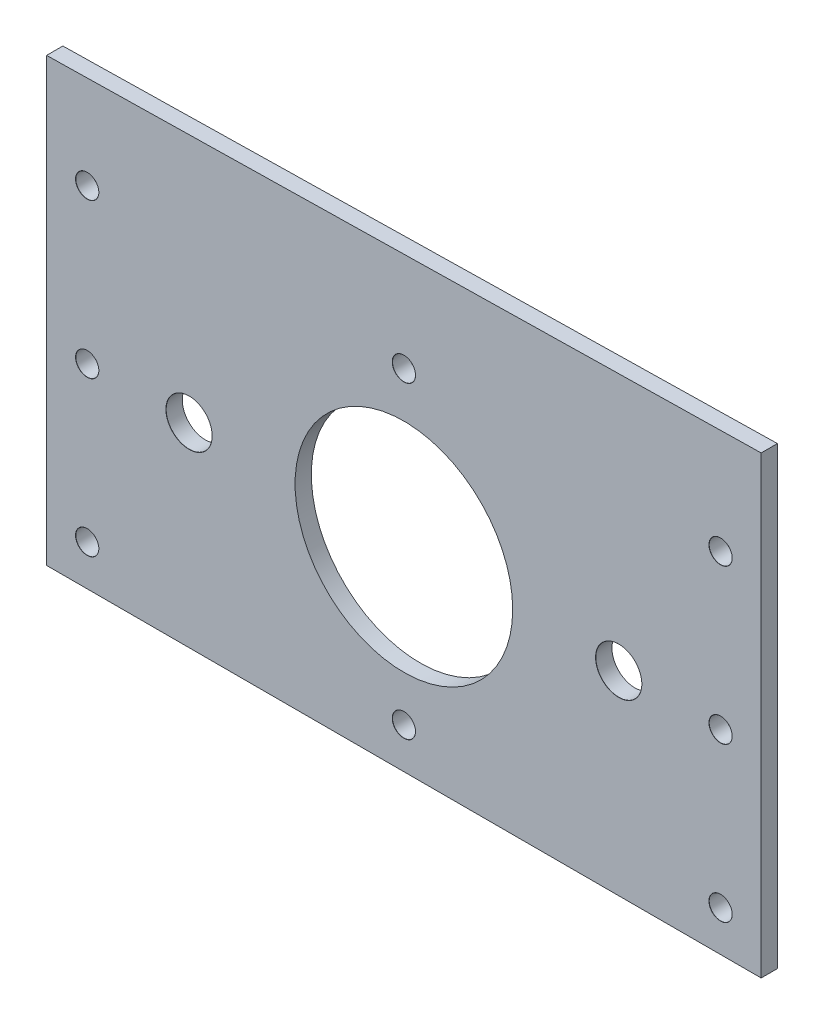
ISO-10303-21;
HEADER;
FILE_DESCRIPTION(('STEP AP214'),'2;1');
FILE_NAME('part.step','',(''),(''),'','','');
FILE_SCHEMA(('AUTOMOTIVE_DESIGN { 1 0 10303 214 1 1 1 1 }'));
ENDSEC;
DATA;
#1=APPLICATION_CONTEXT('core data for automotive mechanical design processes');
#2=APPLICATION_PROTOCOL_DEFINITION('international standard','automotive_design',2000,#1);
#3=PRODUCT_CONTEXT('',#1,'mechanical');
#4=PRODUCT('Part','Part','',(#3));
#5=PRODUCT_RELATED_PRODUCT_CATEGORY('part','',(#4));
#6=PRODUCT_DEFINITION_FORMATION('','',#4);
#7=PRODUCT_DEFINITION_CONTEXT('part definition',#1,'design');
#8=PRODUCT_DEFINITION('design','',#6,#7);
#9=PRODUCT_DEFINITION_SHAPE('','',#8);
#10=(LENGTH_UNIT() NAMED_UNIT(*) SI_UNIT(.MILLI.,.METRE.));
#11=(NAMED_UNIT(*) PLANE_ANGLE_UNIT() SI_UNIT($,.RADIAN.));
#12=(NAMED_UNIT(*) SI_UNIT($,.STERADIAN.) SOLID_ANGLE_UNIT());
#13=UNCERTAINTY_MEASURE_WITH_UNIT(LENGTH_MEASURE(1.E-05),#10,'distance_accuracy_value','');
#14=(GEOMETRIC_REPRESENTATION_CONTEXT(3) GLOBAL_UNCERTAINTY_ASSIGNED_CONTEXT((#13)) GLOBAL_UNIT_ASSIGNED_CONTEXT((#10,
#11,#12)) REPRESENTATION_CONTEXT('',''));
#15=CARTESIAN_POINT('',(0.,0.,0.));
#16=DIRECTION('',(0.,0.,1.));
#17=DIRECTION('',(1.,0.,0.));
#18=AXIS2_PLACEMENT_3D('',#15,#16,#17);
#19=CARTESIAN_POINT('',(69.85,38.1,3.175));
#20=DIRECTION('',(-1.,0.,0.));
#21=DIRECTION('',(0.,0.,1.));
#22=AXIS2_PLACEMENT_3D('',#19,#20,#21);
#23=PLANE('',#22);
#24=DIRECTION('',(0.,1.,0.));
#25=VECTOR('',#24,1.);
#26=CARTESIAN_POINT('',(69.85,38.1,0.));
#27=LINE('',#26,#25);
#28=CARTESIAN_POINT('',(69.85,-38.1,0.));
#29=VERTEX_POINT('',#28);
#30=CARTESIAN_POINT('',(69.85,50.8,0.));
#31=VERTEX_POINT('',#30);
#32=EDGE_CURVE('E80',#29,#31,#27,.T.);
#33=ORIENTED_EDGE('',*,*,#32,.T.);
#34=DIRECTION('',(0.,0.,-1.));
#35=VECTOR('',#34,1.);
#36=CARTESIAN_POINT('',(69.85,50.8,3.175));
#37=LINE('',#36,#35);
#38=CARTESIAN_POINT('',(69.85,50.8,3.175));
#39=VERTEX_POINT('',#38);
#40=EDGE_CURVE('E11',#39,#31,#37,.T.);
#41=ORIENTED_EDGE('',*,*,#40,.F.);
#42=DIRECTION('',(0.,1.,0.));
#43=VECTOR('',#42,1.);
#44=CARTESIAN_POINT('',(69.85,38.1,3.175));
#45=LINE('',#44,#43);
#46=CARTESIAN_POINT('',(69.85,-38.1,3.175));
#47=VERTEX_POINT('',#46);
#48=EDGE_CURVE('E85',#47,#39,#45,.T.);
#49=ORIENTED_EDGE('',*,*,#48,.F.);
#50=DIRECTION('',(0.,0.,-1.));
#51=VECTOR('',#50,1.);
#52=CARTESIAN_POINT('',(69.85,-38.1,3.175));
#53=LINE('',#52,#51);
#54=EDGE_CURVE('E101',#47,#29,#53,.T.);
#55=ORIENTED_EDGE('',*,*,#54,.T.);
#56=EDGE_LOOP('',(#33,#41,#49,#55));
#57=FACE_BOUND('',#56,.T.);
#58=ADVANCED_FACE('F41',(#57),#23,.F.);
#59=CARTESIAN_POINT('',(-69.85,48.26,3.175));
#60=DIRECTION('',(0.0181788136675149,-0.999834751713323,0.));
#61=DIRECTION('',(0.999834751713323,0.0181788136675149,0.));
#62=AXIS2_PLACEMENT_3D('',#59,#60,#61);
#63=PLANE('',#62);
#64=DIRECTION('',(-0.999834751713323,-0.0181788136675149,0.));
#65=VECTOR('',#64,1.);
#66=CARTESIAN_POINT('',(-69.85,48.26,0.));
#67=LINE('',#66,#65);
#68=CARTESIAN_POINT('',(-69.85,48.26,0.));
#69=VERTEX_POINT('',#68);
#70=EDGE_CURVE('E97',#31,#69,#67,.T.);
#71=ORIENTED_EDGE('',*,*,#70,.T.);
#72=DIRECTION('',(0.,0.,-1.));
#73=VECTOR('',#72,1.);
#74=CARTESIAN_POINT('',(-69.85,48.26,3.175));
#75=LINE('',#74,#73);
#76=CARTESIAN_POINT('',(-69.85,48.26,3.175));
#77=VERTEX_POINT('',#76);
#78=EDGE_CURVE('E49',#77,#69,#75,.T.);
#79=ORIENTED_EDGE('',*,*,#78,.F.);
#80=DIRECTION('',(-0.999834751713323,-0.0181788136675149,0.));
#81=VECTOR('',#80,1.);
#82=CARTESIAN_POINT('',(-69.85,48.26,3.175));
#83=LINE('',#82,#81);
#84=EDGE_CURVE('E88',#39,#77,#83,.T.);
#85=ORIENTED_EDGE('',*,*,#84,.F.);
#86=ORIENTED_EDGE('',*,*,#40,.T.);
#87=EDGE_LOOP('',(#71,#79,#85,#86));
#88=FACE_BOUND('',#87,.T.);
#89=ADVANCED_FACE('F96',(#88),#63,.F.);
#90=CARTESIAN_POINT('',(-69.85,38.1,3.175));
#91=DIRECTION('',(1.,0.,0.));
#92=DIRECTION('',(0.,0.,-1.));
#93=AXIS2_PLACEMENT_3D('',#90,#91,#92);
#94=PLANE('',#93);
#95=DIRECTION('',(0.,-1.,0.));
#96=VECTOR('',#95,1.);
#97=CARTESIAN_POINT('',(-69.85,38.1,0.));
#98=LINE('',#97,#96);
#99=CARTESIAN_POINT('',(-69.85,-38.1,0.));
#100=VERTEX_POINT('',#99);
#101=EDGE_CURVE('E73',#69,#100,#98,.T.);
#102=ORIENTED_EDGE('',*,*,#101,.T.);
#103=DIRECTION('',(0.,0.,-1.));
#104=VECTOR('',#103,1.);
#105=CARTESIAN_POINT('',(-69.85,-38.1,3.175));
#106=LINE('',#105,#104);
#107=CARTESIAN_POINT('',(-69.85,-38.1,3.175));
#108=VERTEX_POINT('',#107);
#109=EDGE_CURVE('E98',#108,#100,#106,.T.);
#110=ORIENTED_EDGE('',*,*,#109,.F.);
#111=DIRECTION('',(0.,-1.,0.));
#112=VECTOR('',#111,1.);
#113=CARTESIAN_POINT('',(-69.85,48.26,3.175));
#114=LINE('',#113,#112);
#115=EDGE_CURVE('E92',#77,#108,#114,.T.);
#116=ORIENTED_EDGE('',*,*,#115,.F.);
#117=ORIENTED_EDGE('',*,*,#78,.T.);
#118=EDGE_LOOP('',(#102,#110,#116,#117));
#119=FACE_BOUND('',#118,.T.);
#120=ADVANCED_FACE('F99',(#119),#94,.F.);
#121=CARTESIAN_POINT('',(-69.85,-38.1,3.175));
#122=DIRECTION('',(0.,1.,0.));
#123=DIRECTION('',(0.,0.,1.));
#124=AXIS2_PLACEMENT_3D('',#121,#122,#123);
#125=PLANE('',#124);
#126=DIRECTION('',(1.,0.,0.));
#127=VECTOR('',#126,1.);
#128=CARTESIAN_POINT('',(-69.85,-38.1,0.));
#129=LINE('',#128,#127);
#130=EDGE_CURVE('E109',#100,#29,#129,.T.);
#131=ORIENTED_EDGE('',*,*,#130,.T.);
#132=ORIENTED_EDGE('',*,*,#54,.F.);
#133=DIRECTION('',(1.,0.,0.));
#134=VECTOR('',#133,1.);
#135=CARTESIAN_POINT('',(-69.85,-38.1,3.175));
#136=LINE('',#135,#134);
#137=EDGE_CURVE('E57',#108,#47,#136,.T.);
#138=ORIENTED_EDGE('',*,*,#137,.F.);
#139=ORIENTED_EDGE('',*,*,#109,.T.);
#140=EDGE_LOOP('',(#131,#132,#138,#139));
#141=FACE_BOUND('',#140,.T.);
#142=ADVANCED_FACE('F114',(#141),#125,.F.);
#143=CARTESIAN_POINT('',(0.,0.,3.175));
#144=DIRECTION('',(0.,0.,1.));
#145=DIRECTION('',(1.,0.,0.));
#146=AXIS2_PLACEMENT_3D('',#143,#144,#145);
#147=PLANE('',#146);
#148=CARTESIAN_POINT('',(0.,0.,3.175));
#149=DIRECTION('',(0.,0.,1.));
#150=DIRECTION('',(1.,0.,0.));
#151=AXIS2_PLACEMENT_3D('',#148,#149,#150);
#152=CIRCLE('',#151,21.275);
#153=CARTESIAN_POINT('',(21.275,0.,3.175));
#154=VERTEX_POINT('',#153);
#155=EDGE_CURVE('E228',#154,#154,#152,.T.);
#156=ORIENTED_EDGE('',*,*,#155,.F.);
#157=EDGE_LOOP('',(#156));
#158=FACE_BOUND('',#157,.T.);
#159=CARTESIAN_POINT('',(-42.,0.,3.175));
#160=DIRECTION('',(0.,0.,1.));
#161=DIRECTION('',(1.,0.,0.));
#162=AXIS2_PLACEMENT_3D('',#159,#160,#161);
#163=CIRCLE('',#162,4.525);
#164=CARTESIAN_POINT('',(-37.475,0.,3.175));
#165=VERTEX_POINT('',#164);
#166=EDGE_CURVE('E224',#165,#165,#163,.T.);
#167=ORIENTED_EDGE('',*,*,#166,.F.);
#168=EDGE_LOOP('',(#167));
#169=FACE_BOUND('',#168,.T.);
#170=CARTESIAN_POINT('',(42.,0.,3.175));
#171=DIRECTION('',(0.,0.,1.));
#172=DIRECTION('',(1.,0.,0.));
#173=AXIS2_PLACEMENT_3D('',#170,#171,#172);
#174=CIRCLE('',#173,4.525);
#175=CARTESIAN_POINT('',(46.525,0.,3.175));
#176=VERTEX_POINT('',#175);
#177=EDGE_CURVE('E215',#176,#176,#174,.T.);
#178=ORIENTED_EDGE('',*,*,#177,.F.);
#179=EDGE_LOOP('',(#178));
#180=FACE_BOUND('',#179,.T.);
#181=CARTESIAN_POINT('',(-61.9125,-30.1625,3.175));
#182=DIRECTION('',(0.,0.,1.));
#183=DIRECTION('',(1.,0.,0.));
#184=AXIS2_PLACEMENT_3D('',#181,#182,#183);
#185=CIRCLE('',#184,2.275);
#186=CARTESIAN_POINT('',(-59.6375,-30.1625,3.175));
#187=VERTEX_POINT('',#186);
#188=EDGE_CURVE('E206',#187,#187,#185,.T.);
#189=ORIENTED_EDGE('',*,*,#188,.F.);
#190=EDGE_LOOP('',(#189));
#191=FACE_BOUND('',#190,.T.);
#192=CARTESIAN_POINT('',(0.,-30.1625,3.175));
#193=DIRECTION('',(0.,0.,1.));
#194=DIRECTION('',(1.,0.,0.));
#195=AXIS2_PLACEMENT_3D('',#192,#193,#194);
#196=CIRCLE('',#195,2.275);
#197=CARTESIAN_POINT('',(2.275,-30.1625,3.175));
#198=VERTEX_POINT('',#197);
#199=EDGE_CURVE('E197',#198,#198,#196,.T.);
#200=ORIENTED_EDGE('',*,*,#199,.F.);
#201=EDGE_LOOP('',(#200));
#202=FACE_BOUND('',#201,.T.);
#203=CARTESIAN_POINT('',(61.9125,-30.1625,3.175));
#204=DIRECTION('',(0.,0.,1.));
#205=DIRECTION('',(1.,0.,0.));
#206=AXIS2_PLACEMENT_3D('',#203,#204,#205);
#207=CIRCLE('',#206,2.275);
#208=CARTESIAN_POINT('',(64.1875,-30.1625,3.175));
#209=VERTEX_POINT('',#208);
#210=EDGE_CURVE('E188',#209,#209,#207,.T.);
#211=ORIENTED_EDGE('',*,*,#210,.F.);
#212=EDGE_LOOP('',(#211));
#213=FACE_BOUND('',#212,.T.);
#214=CARTESIAN_POINT('',(61.9125,30.1625,3.175));
#215=DIRECTION('',(0.,0.,1.));
#216=DIRECTION('',(1.,0.,0.));
#217=AXIS2_PLACEMENT_3D('',#214,#215,#216);
#218=CIRCLE('',#217,2.275);
#219=CARTESIAN_POINT('',(64.1875,30.1625,3.175));
#220=VERTEX_POINT('',#219);
#221=EDGE_CURVE('E179',#220,#220,#218,.T.);
#222=ORIENTED_EDGE('',*,*,#221,.F.);
#223=EDGE_LOOP('',(#222));
#224=FACE_BOUND('',#223,.T.);
#225=CARTESIAN_POINT('',(61.9125,0.,3.175));
#226=DIRECTION('',(0.,0.,1.));
#227=DIRECTION('',(1.,0.,0.));
#228=AXIS2_PLACEMENT_3D('',#225,#226,#227);
#229=CIRCLE('',#228,2.275);
#230=CARTESIAN_POINT('',(64.1875,0.,3.175));
#231=VERTEX_POINT('',#230);
#232=EDGE_CURVE('E170',#231,#231,#229,.T.);
#233=ORIENTED_EDGE('',*,*,#232,.F.);
#234=EDGE_LOOP('',(#233));
#235=FACE_BOUND('',#234,.T.);
#236=CARTESIAN_POINT('',(0.,30.1625,3.175));
#237=DIRECTION('',(0.,0.,1.));
#238=DIRECTION('',(1.,0.,0.));
#239=AXIS2_PLACEMENT_3D('',#236,#237,#238);
#240=CIRCLE('',#239,2.275);
#241=CARTESIAN_POINT('',(2.27499999999999,30.1625,3.175));
#242=VERTEX_POINT('',#241);
#243=EDGE_CURVE('E161',#242,#242,#240,.T.);
#244=ORIENTED_EDGE('',*,*,#243,.F.);
#245=EDGE_LOOP('',(#244));
#246=FACE_BOUND('',#245,.T.);
#247=CARTESIAN_POINT('',(-61.9125,30.1625,3.175));
#248=DIRECTION('',(0.,0.,1.));
#249=DIRECTION('',(1.,0.,0.));
#250=AXIS2_PLACEMENT_3D('',#247,#248,#249);
#251=CIRCLE('',#250,2.275);
#252=CARTESIAN_POINT('',(-59.6375,30.1625,3.175));
#253=VERTEX_POINT('',#252);
#254=EDGE_CURVE('E152',#253,#253,#251,.T.);
#255=ORIENTED_EDGE('',*,*,#254,.F.);
#256=EDGE_LOOP('',(#255));
#257=FACE_BOUND('',#256,.T.);
#258=CARTESIAN_POINT('',(-61.9125,0.,3.175));
#259=DIRECTION('',(0.,0.,1.));
#260=DIRECTION('',(1.,0.,0.));
#261=AXIS2_PLACEMENT_3D('',#258,#259,#260);
#262=CIRCLE('',#261,2.275);
#263=CARTESIAN_POINT('',(-59.6375,0.,3.175));
#264=VERTEX_POINT('',#263);
#265=EDGE_CURVE('E143',#264,#264,#262,.T.);
#266=ORIENTED_EDGE('',*,*,#265,.F.);
#267=EDGE_LOOP('',(#266));
#268=FACE_BOUND('',#267,.T.);
#269=ORIENTED_EDGE('',*,*,#48,.T.);
#270=ORIENTED_EDGE('',*,*,#84,.T.);
#271=ORIENTED_EDGE('',*,*,#115,.T.);
#272=ORIENTED_EDGE('',*,*,#137,.T.);
#273=EDGE_LOOP('',(#269,#270,#271,#272));
#274=FACE_BOUND('',#273,.T.);
#275=ADVANCED_FACE('F90',(#158,#169,#180,#191,#202,#213,#224,#235,#246,#257,#268,#274),#147,.T.);
#276=CARTESIAN_POINT('',(0.,0.,0.));
#277=DIRECTION('',(0.,0.,1.));
#278=DIRECTION('',(1.,0.,0.));
#279=AXIS2_PLACEMENT_3D('',#276,#277,#278);
#280=PLANE('',#279);
#281=CARTESIAN_POINT('',(0.,0.,0.));
#282=DIRECTION('',(0.,0.,1.));
#283=DIRECTION('',(1.,0.,0.));
#284=AXIS2_PLACEMENT_3D('',#281,#282,#283);
#285=CIRCLE('',#284,21.275);
#286=CARTESIAN_POINT('',(21.275,0.,0.));
#287=VERTEX_POINT('',#286);
#288=EDGE_CURVE('E227',#287,#287,#285,.T.);
#289=ORIENTED_EDGE('',*,*,#288,.T.);
#290=EDGE_LOOP('',(#289));
#291=FACE_BOUND('',#290,.T.);
#292=CARTESIAN_POINT('',(-42.,0.,0.));
#293=DIRECTION('',(0.,0.,1.));
#294=DIRECTION('',(1.,0.,0.));
#295=AXIS2_PLACEMENT_3D('',#292,#293,#294);
#296=CIRCLE('',#295,4.5);
#297=CARTESIAN_POINT('',(-37.5,0.,0.));
#298=VERTEX_POINT('',#297);
#299=EDGE_CURVE('E218',#298,#298,#296,.T.);
#300=ORIENTED_EDGE('',*,*,#299,.T.);
#301=EDGE_LOOP('',(#300));
#302=FACE_BOUND('',#301,.T.);
#303=CARTESIAN_POINT('',(42.,0.,0.));
#304=DIRECTION('',(0.,0.,1.));
#305=DIRECTION('',(1.,0.,0.));
#306=AXIS2_PLACEMENT_3D('',#303,#304,#305);
#307=CIRCLE('',#306,4.5);
#308=CARTESIAN_POINT('',(46.5,0.,0.));
#309=VERTEX_POINT('',#308);
#310=EDGE_CURVE('E209',#309,#309,#307,.T.);
#311=ORIENTED_EDGE('',*,*,#310,.T.);
#312=EDGE_LOOP('',(#311));
#313=FACE_BOUND('',#312,.T.);
#314=CARTESIAN_POINT('',(-61.9125,-30.1625,0.));
#315=DIRECTION('',(0.,0.,1.));
#316=DIRECTION('',(1.,0.,0.));
#317=AXIS2_PLACEMENT_3D('',#314,#315,#316);
#318=CIRCLE('',#317,2.25);
#319=CARTESIAN_POINT('',(-59.6625,-30.1625,0.));
#320=VERTEX_POINT('',#319);
#321=EDGE_CURVE('E200',#320,#320,#318,.T.);
#322=ORIENTED_EDGE('',*,*,#321,.T.);
#323=EDGE_LOOP('',(#322));
#324=FACE_BOUND('',#323,.T.);
#325=CARTESIAN_POINT('',(0.,-30.1625,0.));
#326=DIRECTION('',(0.,0.,1.));
#327=DIRECTION('',(1.,0.,0.));
#328=AXIS2_PLACEMENT_3D('',#325,#326,#327);
#329=CIRCLE('',#328,2.25);
#330=CARTESIAN_POINT('',(2.25,-30.1625,0.));
#331=VERTEX_POINT('',#330);
#332=EDGE_CURVE('E191',#331,#331,#329,.T.);
#333=ORIENTED_EDGE('',*,*,#332,.T.);
#334=EDGE_LOOP('',(#333));
#335=FACE_BOUND('',#334,.T.);
#336=CARTESIAN_POINT('',(61.9125,-30.1625,0.));
#337=DIRECTION('',(0.,0.,1.));
#338=DIRECTION('',(1.,0.,0.));
#339=AXIS2_PLACEMENT_3D('',#336,#337,#338);
#340=CIRCLE('',#339,2.25);
#341=CARTESIAN_POINT('',(64.1625,-30.1625,0.));
#342=VERTEX_POINT('',#341);
#343=EDGE_CURVE('E182',#342,#342,#340,.T.);
#344=ORIENTED_EDGE('',*,*,#343,.T.);
#345=EDGE_LOOP('',(#344));
#346=FACE_BOUND('',#345,.T.);
#347=CARTESIAN_POINT('',(61.9125,30.1625,0.));
#348=DIRECTION('',(0.,0.,1.));
#349=DIRECTION('',(1.,0.,0.));
#350=AXIS2_PLACEMENT_3D('',#347,#348,#349);
#351=CIRCLE('',#350,2.25);
#352=CARTESIAN_POINT('',(64.1625,30.1625,0.));
#353=VERTEX_POINT('',#352);
#354=EDGE_CURVE('E173',#353,#353,#351,.T.);
#355=ORIENTED_EDGE('',*,*,#354,.T.);
#356=EDGE_LOOP('',(#355));
#357=FACE_BOUND('',#356,.T.);
#358=CARTESIAN_POINT('',(61.9125,0.,0.));
#359=DIRECTION('',(0.,0.,1.));
#360=DIRECTION('',(1.,0.,0.));
#361=AXIS2_PLACEMENT_3D('',#358,#359,#360);
#362=CIRCLE('',#361,2.25);
#363=CARTESIAN_POINT('',(64.1625,0.,0.));
#364=VERTEX_POINT('',#363);
#365=EDGE_CURVE('E164',#364,#364,#362,.T.);
#366=ORIENTED_EDGE('',*,*,#365,.T.);
#367=EDGE_LOOP('',(#366));
#368=FACE_BOUND('',#367,.T.);
#369=CARTESIAN_POINT('',(0.,30.1625,0.));
#370=DIRECTION('',(0.,0.,1.));
#371=DIRECTION('',(1.,0.,0.));
#372=AXIS2_PLACEMENT_3D('',#369,#370,#371);
#373=CIRCLE('',#372,2.25);
#374=CARTESIAN_POINT('',(2.24999999999999,30.1625,0.));
#375=VERTEX_POINT('',#374);
#376=EDGE_CURVE('E155',#375,#375,#373,.T.);
#377=ORIENTED_EDGE('',*,*,#376,.T.);
#378=EDGE_LOOP('',(#377));
#379=FACE_BOUND('',#378,.T.);
#380=CARTESIAN_POINT('',(-61.9125,30.1625,0.));
#381=DIRECTION('',(0.,0.,1.));
#382=DIRECTION('',(1.,0.,0.));
#383=AXIS2_PLACEMENT_3D('',#380,#381,#382);
#384=CIRCLE('',#383,2.25);
#385=CARTESIAN_POINT('',(-59.6625,30.1625,0.));
#386=VERTEX_POINT('',#385);
#387=EDGE_CURVE('E146',#386,#386,#384,.T.);
#388=ORIENTED_EDGE('',*,*,#387,.T.);
#389=EDGE_LOOP('',(#388));
#390=FACE_BOUND('',#389,.T.);
#391=CARTESIAN_POINT('',(-61.9125,0.,0.));
#392=DIRECTION('',(0.,0.,1.));
#393=DIRECTION('',(1.,0.,0.));
#394=AXIS2_PLACEMENT_3D('',#391,#392,#393);
#395=CIRCLE('',#394,2.25);
#396=CARTESIAN_POINT('',(-59.6625,0.,0.));
#397=VERTEX_POINT('',#396);
#398=EDGE_CURVE('E106',#397,#397,#395,.T.);
#399=ORIENTED_EDGE('',*,*,#398,.T.);
#400=EDGE_LOOP('',(#399));
#401=FACE_BOUND('',#400,.T.);
#402=ORIENTED_EDGE('',*,*,#32,.F.);
#403=ORIENTED_EDGE('',*,*,#130,.F.);
#404=ORIENTED_EDGE('',*,*,#101,.F.);
#405=ORIENTED_EDGE('',*,*,#70,.F.);
#406=EDGE_LOOP('',(#402,#403,#404,#405));
#407=FACE_BOUND('',#406,.T.);
#408=ADVANCED_FACE('F115',(#291,#302,#313,#324,#335,#346,#357,#368,#379,#390,#401,#407),#280,.F.);
#409=CARTESIAN_POINT('',(-61.9125,0.,3.175));
#410=DIRECTION('',(0.,0.,1.));
#411=DIRECTION('',(1.,0.,0.));
#412=AXIS2_PLACEMENT_3D('',#409,#410,#411);
#413=CYLINDRICAL_SURFACE('',#412,2.25);
#414=ORIENTED_EDGE('',*,*,#398,.F.);
#415=EDGE_LOOP('',(#414));
#416=FACE_BOUND('',#415,.T.);
#417=CARTESIAN_POINT('',(-61.9125,0.,3.15));
#418=DIRECTION('',(0.,0.,1.));
#419=DIRECTION('',(1.,0.,0.));
#420=AXIS2_PLACEMENT_3D('',#417,#418,#419);
#421=CIRCLE('',#420,2.25);
#422=CARTESIAN_POINT('',(-59.6625,0.,3.15));
#423=VERTEX_POINT('',#422);
#424=EDGE_CURVE('E140',#423,#423,#421,.T.);
#425=ORIENTED_EDGE('',*,*,#424,.T.);
#426=EDGE_LOOP('',(#425));
#427=FACE_BOUND('',#426,.T.);
#428=ADVANCED_FACE('F117',(#416,#427),#413,.F.);
#429=CARTESIAN_POINT('',(-61.9125,0.,3.175));
#430=DIRECTION('',(0.,0.,1.));
#431=DIRECTION('',(1.,0.,0.));
#432=AXIS2_PLACEMENT_3D('',#429,#430,#431);
#433=CONICAL_SURFACE('',#432,2.275,0.785398163397353);
#434=ORIENTED_EDGE('',*,*,#424,.F.);
#435=EDGE_LOOP('',(#434));
#436=FACE_BOUND('',#435,.T.);
#437=ORIENTED_EDGE('',*,*,#265,.T.);
#438=EDGE_LOOP('',(#437));
#439=FACE_BOUND('',#438,.T.);
#440=ADVANCED_FACE('F124',(#436,#439),#433,.F.);
#441=CARTESIAN_POINT('',(-61.9125,30.1625,3.175));
#442=DIRECTION('',(0.,0.,1.));
#443=DIRECTION('',(1.,0.,0.));
#444=AXIS2_PLACEMENT_3D('',#441,#442,#443);
#445=CYLINDRICAL_SURFACE('',#444,2.25);
#446=ORIENTED_EDGE('',*,*,#387,.F.);
#447=EDGE_LOOP('',(#446));
#448=FACE_BOUND('',#447,.T.);
#449=CARTESIAN_POINT('',(-61.9125,30.1625,3.15));
#450=DIRECTION('',(0.,0.,1.));
#451=DIRECTION('',(1.,0.,0.));
#452=AXIS2_PLACEMENT_3D('',#449,#450,#451);
#453=CIRCLE('',#452,2.25);
#454=CARTESIAN_POINT('',(-59.6625,30.1625,3.15));
#455=VERTEX_POINT('',#454);
#456=EDGE_CURVE('E149',#455,#455,#453,.T.);
#457=ORIENTED_EDGE('',*,*,#456,.T.);
#458=EDGE_LOOP('',(#457));
#459=FACE_BOUND('',#458,.T.);
#460=ADVANCED_FACE('F261',(#448,#459),#445,.F.);
#461=CARTESIAN_POINT('',(-61.9125,30.1625,3.175));
#462=DIRECTION('',(0.,0.,1.));
#463=DIRECTION('',(1.,0.,0.));
#464=AXIS2_PLACEMENT_3D('',#461,#462,#463);
#465=CONICAL_SURFACE('',#464,2.275,0.785398163397353);
#466=ORIENTED_EDGE('',*,*,#456,.F.);
#467=EDGE_LOOP('',(#466));
#468=FACE_BOUND('',#467,.T.);
#469=ORIENTED_EDGE('',*,*,#254,.T.);
#470=EDGE_LOOP('',(#469));
#471=FACE_BOUND('',#470,.T.);
#472=ADVANCED_FACE('F267',(#468,#471),#465,.F.);
#473=CARTESIAN_POINT('',(0.,30.1625,3.175));
#474=DIRECTION('',(0.,0.,1.));
#475=DIRECTION('',(1.,0.,0.));
#476=AXIS2_PLACEMENT_3D('',#473,#474,#475);
#477=CYLINDRICAL_SURFACE('',#476,2.25);
#478=ORIENTED_EDGE('',*,*,#376,.F.);
#479=EDGE_LOOP('',(#478));
#480=FACE_BOUND('',#479,.T.);
#481=CARTESIAN_POINT('',(0.,30.1625,3.15));
#482=DIRECTION('',(0.,0.,1.));
#483=DIRECTION('',(1.,0.,0.));
#484=AXIS2_PLACEMENT_3D('',#481,#482,#483);
#485=CIRCLE('',#484,2.25);
#486=CARTESIAN_POINT('',(2.24999999999999,30.1625,3.15));
#487=VERTEX_POINT('',#486);
#488=EDGE_CURVE('E158',#487,#487,#485,.T.);
#489=ORIENTED_EDGE('',*,*,#488,.T.);
#490=EDGE_LOOP('',(#489));
#491=FACE_BOUND('',#490,.T.);
#492=ADVANCED_FACE('F274',(#480,#491),#477,.F.);
#493=CARTESIAN_POINT('',(0.,30.1625,3.175));
#494=DIRECTION('',(0.,0.,1.));
#495=DIRECTION('',(1.,0.,0.));
#496=AXIS2_PLACEMENT_3D('',#493,#494,#495);
#497=CONICAL_SURFACE('',#496,2.275,0.785398163397396);
#498=ORIENTED_EDGE('',*,*,#488,.F.);
#499=EDGE_LOOP('',(#498));
#500=FACE_BOUND('',#499,.T.);
#501=ORIENTED_EDGE('',*,*,#243,.T.);
#502=EDGE_LOOP('',(#501));
#503=FACE_BOUND('',#502,.T.);
#504=ADVANCED_FACE('F278',(#500,#503),#497,.F.);
#505=CARTESIAN_POINT('',(61.9125,0.,3.175));
#506=DIRECTION('',(0.,0.,1.));
#507=DIRECTION('',(1.,0.,0.));
#508=AXIS2_PLACEMENT_3D('',#505,#506,#507);
#509=CYLINDRICAL_SURFACE('',#508,2.25);
#510=ORIENTED_EDGE('',*,*,#365,.F.);
#511=EDGE_LOOP('',(#510));
#512=FACE_BOUND('',#511,.T.);
#513=CARTESIAN_POINT('',(61.9125,0.,3.15));
#514=DIRECTION('',(0.,0.,1.));
#515=DIRECTION('',(1.,0.,0.));
#516=AXIS2_PLACEMENT_3D('',#513,#514,#515);
#517=CIRCLE('',#516,2.25);
#518=CARTESIAN_POINT('',(64.1625,0.,3.15));
#519=VERTEX_POINT('',#518);
#520=EDGE_CURVE('E167',#519,#519,#517,.T.);
#521=ORIENTED_EDGE('',*,*,#520,.T.);
#522=EDGE_LOOP('',(#521));
#523=FACE_BOUND('',#522,.T.);
#524=ADVANCED_FACE('F282',(#512,#523),#509,.F.);
#525=CARTESIAN_POINT('',(61.9125,0.,3.175));
#526=DIRECTION('',(0.,0.,1.));
#527=DIRECTION('',(1.,0.,0.));
#528=AXIS2_PLACEMENT_3D('',#525,#526,#527);
#529=CONICAL_SURFACE('',#528,2.275,0.785398163397353);
#530=ORIENTED_EDGE('',*,*,#520,.F.);
#531=EDGE_LOOP('',(#530));
#532=FACE_BOUND('',#531,.T.);
#533=ORIENTED_EDGE('',*,*,#232,.T.);
#534=EDGE_LOOP('',(#533));
#535=FACE_BOUND('',#534,.T.);
#536=ADVANCED_FACE('F286',(#532,#535),#529,.F.);
#537=CARTESIAN_POINT('',(61.9125,30.1625,3.175));
#538=DIRECTION('',(0.,0.,1.));
#539=DIRECTION('',(1.,0.,0.));
#540=AXIS2_PLACEMENT_3D('',#537,#538,#539);
#541=CYLINDRICAL_SURFACE('',#540,2.25);
#542=ORIENTED_EDGE('',*,*,#354,.F.);
#543=EDGE_LOOP('',(#542));
#544=FACE_BOUND('',#543,.T.);
#545=CARTESIAN_POINT('',(61.9125,30.1625,3.15));
#546=DIRECTION('',(0.,0.,1.));
#547=DIRECTION('',(1.,0.,0.));
#548=AXIS2_PLACEMENT_3D('',#545,#546,#547);
#549=CIRCLE('',#548,2.25);
#550=CARTESIAN_POINT('',(64.1625,30.1625,3.15));
#551=VERTEX_POINT('',#550);
#552=EDGE_CURVE('E176',#551,#551,#549,.T.);
#553=ORIENTED_EDGE('',*,*,#552,.T.);
#554=EDGE_LOOP('',(#553));
#555=FACE_BOUND('',#554,.T.);
#556=ADVANCED_FACE('F290',(#544,#555),#541,.F.);
#557=CARTESIAN_POINT('',(61.9125,30.1625,3.175));
#558=DIRECTION('',(0.,0.,1.));
#559=DIRECTION('',(1.,0.,0.));
#560=AXIS2_PLACEMENT_3D('',#557,#558,#559);
#561=CONICAL_SURFACE('',#560,2.275,0.785398163397353);
#562=ORIENTED_EDGE('',*,*,#552,.F.);
#563=EDGE_LOOP('',(#562));
#564=FACE_BOUND('',#563,.T.);
#565=ORIENTED_EDGE('',*,*,#221,.T.);
#566=EDGE_LOOP('',(#565));
#567=FACE_BOUND('',#566,.T.);
#568=ADVANCED_FACE('F294',(#564,#567),#561,.F.);
#569=CARTESIAN_POINT('',(61.9125,-30.1625,3.175));
#570=DIRECTION('',(0.,0.,1.));
#571=DIRECTION('',(1.,0.,0.));
#572=AXIS2_PLACEMENT_3D('',#569,#570,#571);
#573=CYLINDRICAL_SURFACE('',#572,2.25);
#574=ORIENTED_EDGE('',*,*,#343,.F.);
#575=EDGE_LOOP('',(#574));
#576=FACE_BOUND('',#575,.T.);
#577=CARTESIAN_POINT('',(61.9125,-30.1625,3.15));
#578=DIRECTION('',(0.,0.,1.));
#579=DIRECTION('',(1.,0.,0.));
#580=AXIS2_PLACEMENT_3D('',#577,#578,#579);
#581=CIRCLE('',#580,2.25);
#582=CARTESIAN_POINT('',(64.1625,-30.1625,3.15));
#583=VERTEX_POINT('',#582);
#584=EDGE_CURVE('E185',#583,#583,#581,.T.);
#585=ORIENTED_EDGE('',*,*,#584,.T.);
#586=EDGE_LOOP('',(#585));
#587=FACE_BOUND('',#586,.T.);
#588=ADVANCED_FACE('F298',(#576,#587),#573,.F.);
#589=CARTESIAN_POINT('',(61.9125,-30.1625,3.175));
#590=DIRECTION('',(0.,0.,1.));
#591=DIRECTION('',(1.,0.,0.));
#592=AXIS2_PLACEMENT_3D('',#589,#590,#591);
#593=CONICAL_SURFACE('',#592,2.275,0.785398163397353);
#594=ORIENTED_EDGE('',*,*,#584,.F.);
#595=EDGE_LOOP('',(#594));
#596=FACE_BOUND('',#595,.T.);
#597=ORIENTED_EDGE('',*,*,#210,.T.);
#598=EDGE_LOOP('',(#597));
#599=FACE_BOUND('',#598,.T.);
#600=ADVANCED_FACE('F302',(#596,#599),#593,.F.);
#601=CARTESIAN_POINT('',(0.,-30.1625,3.175));
#602=DIRECTION('',(0.,0.,1.));
#603=DIRECTION('',(1.,0.,0.));
#604=AXIS2_PLACEMENT_3D('',#601,#602,#603);
#605=CYLINDRICAL_SURFACE('',#604,2.25);
#606=ORIENTED_EDGE('',*,*,#332,.F.);
#607=EDGE_LOOP('',(#606));
#608=FACE_BOUND('',#607,.T.);
#609=CARTESIAN_POINT('',(0.,-30.1625,3.15));
#610=DIRECTION('',(0.,0.,1.));
#611=DIRECTION('',(1.,0.,0.));
#612=AXIS2_PLACEMENT_3D('',#609,#610,#611);
#613=CIRCLE('',#612,2.25);
#614=CARTESIAN_POINT('',(2.25,-30.1625,3.15));
#615=VERTEX_POINT('',#614);
#616=EDGE_CURVE('E194',#615,#615,#613,.T.);
#617=ORIENTED_EDGE('',*,*,#616,.T.);
#618=EDGE_LOOP('',(#617));
#619=FACE_BOUND('',#618,.T.);
#620=ADVANCED_FACE('F306',(#608,#619),#605,.F.);
#621=CARTESIAN_POINT('',(0.,-30.1625,3.175));
#622=DIRECTION('',(0.,0.,1.));
#623=DIRECTION('',(1.,0.,0.));
#624=AXIS2_PLACEMENT_3D('',#621,#622,#623);
#625=CONICAL_SURFACE('',#624,2.275,0.785398163397396);
#626=ORIENTED_EDGE('',*,*,#616,.F.);
#627=EDGE_LOOP('',(#626));
#628=FACE_BOUND('',#627,.T.);
#629=ORIENTED_EDGE('',*,*,#199,.T.);
#630=EDGE_LOOP('',(#629));
#631=FACE_BOUND('',#630,.T.);
#632=ADVANCED_FACE('F310',(#628,#631),#625,.F.);
#633=CARTESIAN_POINT('',(-61.9125,-30.1625,3.175));
#634=DIRECTION('',(0.,0.,1.));
#635=DIRECTION('',(1.,0.,0.));
#636=AXIS2_PLACEMENT_3D('',#633,#634,#635);
#637=CYLINDRICAL_SURFACE('',#636,2.25);
#638=ORIENTED_EDGE('',*,*,#321,.F.);
#639=EDGE_LOOP('',(#638));
#640=FACE_BOUND('',#639,.T.);
#641=CARTESIAN_POINT('',(-61.9125,-30.1625,3.15));
#642=DIRECTION('',(0.,0.,1.));
#643=DIRECTION('',(1.,0.,0.));
#644=AXIS2_PLACEMENT_3D('',#641,#642,#643);
#645=CIRCLE('',#644,2.25);
#646=CARTESIAN_POINT('',(-59.6625,-30.1625,3.15));
#647=VERTEX_POINT('',#646);
#648=EDGE_CURVE('E203',#647,#647,#645,.T.);
#649=ORIENTED_EDGE('',*,*,#648,.T.);
#650=EDGE_LOOP('',(#649));
#651=FACE_BOUND('',#650,.T.);
#652=ADVANCED_FACE('F314',(#640,#651),#637,.F.);
#653=CARTESIAN_POINT('',(-61.9125,-30.1625,3.175));
#654=DIRECTION('',(0.,0.,1.));
#655=DIRECTION('',(1.,0.,0.));
#656=AXIS2_PLACEMENT_3D('',#653,#654,#655);
#657=CONICAL_SURFACE('',#656,2.275,0.785398163397353);
#658=ORIENTED_EDGE('',*,*,#648,.F.);
#659=EDGE_LOOP('',(#658));
#660=FACE_BOUND('',#659,.T.);
#661=ORIENTED_EDGE('',*,*,#188,.T.);
#662=EDGE_LOOP('',(#661));
#663=FACE_BOUND('',#662,.T.);
#664=ADVANCED_FACE('F318',(#660,#663),#657,.F.);
#665=CARTESIAN_POINT('',(42.,0.,3.175));
#666=DIRECTION('',(0.,0.,1.));
#667=DIRECTION('',(1.,0.,0.));
#668=AXIS2_PLACEMENT_3D('',#665,#666,#667);
#669=CYLINDRICAL_SURFACE('',#668,4.5);
#670=ORIENTED_EDGE('',*,*,#310,.F.);
#671=EDGE_LOOP('',(#670));
#672=FACE_BOUND('',#671,.T.);
#673=CARTESIAN_POINT('',(42.,0.,3.15));
#674=DIRECTION('',(0.,0.,1.));
#675=DIRECTION('',(1.,0.,0.));
#676=AXIS2_PLACEMENT_3D('',#673,#674,#675);
#677=CIRCLE('',#676,4.5);
#678=CARTESIAN_POINT('',(46.5,0.,3.15));
#679=VERTEX_POINT('',#678);
#680=EDGE_CURVE('E212',#679,#679,#677,.T.);
#681=ORIENTED_EDGE('',*,*,#680,.T.);
#682=EDGE_LOOP('',(#681));
#683=FACE_BOUND('',#682,.T.);
#684=ADVANCED_FACE('F322',(#672,#683),#669,.F.);
#685=CARTESIAN_POINT('',(42.,0.,3.175));
#686=DIRECTION('',(0.,0.,1.));
#687=DIRECTION('',(1.,0.,0.));
#688=AXIS2_PLACEMENT_3D('',#685,#686,#687);
#689=CONICAL_SURFACE('',#688,4.525,0.7853981633975);
#690=ORIENTED_EDGE('',*,*,#680,.F.);
#691=EDGE_LOOP('',(#690));
#692=FACE_BOUND('',#691,.T.);
#693=ORIENTED_EDGE('',*,*,#177,.T.);
#694=EDGE_LOOP('',(#693));
#695=FACE_BOUND('',#694,.T.);
#696=ADVANCED_FACE('F326',(#692,#695),#689,.F.);
#697=CARTESIAN_POINT('',(-42.,0.,3.175));
#698=DIRECTION('',(0.,0.,1.));
#699=DIRECTION('',(1.,0.,0.));
#700=AXIS2_PLACEMENT_3D('',#697,#698,#699);
#701=CYLINDRICAL_SURFACE('',#700,4.5);
#702=ORIENTED_EDGE('',*,*,#299,.F.);
#703=EDGE_LOOP('',(#702));
#704=FACE_BOUND('',#703,.T.);
#705=CARTESIAN_POINT('',(-42.,0.,3.15));
#706=DIRECTION('',(0.,0.,1.));
#707=DIRECTION('',(1.,0.,0.));
#708=AXIS2_PLACEMENT_3D('',#705,#706,#707);
#709=CIRCLE('',#708,4.5);
#710=CARTESIAN_POINT('',(-37.5,0.,3.15));
#711=VERTEX_POINT('',#710);
#712=EDGE_CURVE('E221',#711,#711,#709,.T.);
#713=ORIENTED_EDGE('',*,*,#712,.T.);
#714=EDGE_LOOP('',(#713));
#715=FACE_BOUND('',#714,.T.);
#716=ADVANCED_FACE('F330',(#704,#715),#701,.F.);
#717=CARTESIAN_POINT('',(-42.,0.,3.175));
#718=DIRECTION('',(0.,0.,1.));
#719=DIRECTION('',(1.,0.,0.));
#720=AXIS2_PLACEMENT_3D('',#717,#718,#719);
#721=CONICAL_SURFACE('',#720,4.525,0.7853981633975);
#722=ORIENTED_EDGE('',*,*,#712,.F.);
#723=EDGE_LOOP('',(#722));
#724=FACE_BOUND('',#723,.T.);
#725=ORIENTED_EDGE('',*,*,#166,.T.);
#726=EDGE_LOOP('',(#725));
#727=FACE_BOUND('',#726,.T.);
#728=ADVANCED_FACE('F236',(#724,#727),#721,.F.);
#729=CARTESIAN_POINT('',(0.,0.,0.));
#730=DIRECTION('',(0.,0.,1.));
#731=DIRECTION('',(1.,0.,0.));
#732=AXIS2_PLACEMENT_3D('',#729,#730,#731);
#733=CYLINDRICAL_SURFACE('',#732,21.275);
#734=ORIENTED_EDGE('',*,*,#288,.F.);
#735=EDGE_LOOP('',(#734));
#736=FACE_BOUND('',#735,.T.);
#737=ORIENTED_EDGE('',*,*,#155,.T.);
#738=EDGE_LOOP('',(#737));
#739=FACE_BOUND('',#738,.T.);
#740=ADVANCED_FACE('F233',(#736,#739),#733,.F.);
#741=CLOSED_SHELL('',(#58,#89,#120,#142,#275,#408,#428,#440,#460,#472,#492,#504,#524,#536,#556,
#568,#588,#600,#620,#632,#652,#664,#684,#696,#716,#728,#740));
#742=MANIFOLD_SOLID_BREP('B2',#741);
#743=ADVANCED_BREP_SHAPE_REPRESENTATION('',(#18,#742),#14);
#744=SHAPE_DEFINITION_REPRESENTATION(#9,#743);
ENDSEC;
END-ISO-10303-21;
